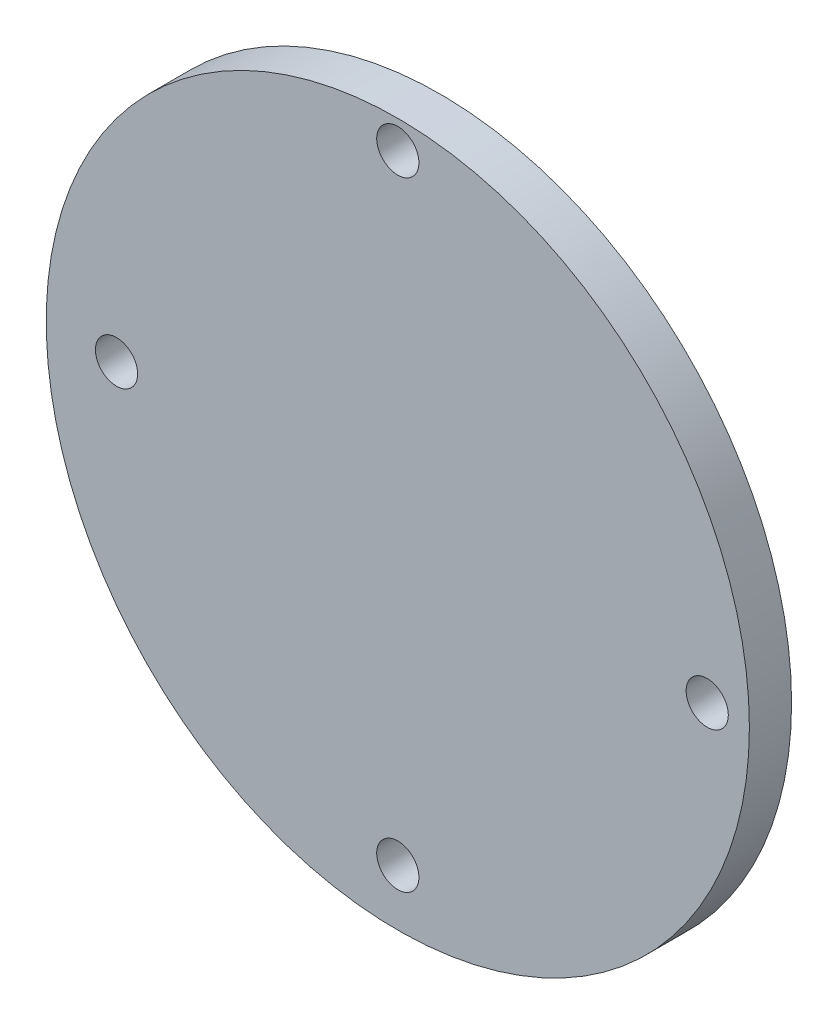
ISO-10303-21;
HEADER;
FILE_DESCRIPTION(('STEP AP214'),'2;1');
FILE_NAME('part.step','',(''),(''),'','','');
FILE_SCHEMA(('AUTOMOTIVE_DESIGN { 1 0 10303 214 1 1 1 1 }'));
ENDSEC;
DATA;
#1=APPLICATION_CONTEXT('core data for automotive mechanical design processes');
#2=APPLICATION_PROTOCOL_DEFINITION('international standard','automotive_design',2000,#1);
#3=PRODUCT_CONTEXT('',#1,'mechanical');
#4=PRODUCT('Part','Part','',(#3));
#5=PRODUCT_RELATED_PRODUCT_CATEGORY('part','',(#4));
#6=PRODUCT_DEFINITION_FORMATION('','',#4);
#7=PRODUCT_DEFINITION_CONTEXT('part definition',#1,'design');
#8=PRODUCT_DEFINITION('design','',#6,#7);
#9=PRODUCT_DEFINITION_SHAPE('','',#8);
#10=(LENGTH_UNIT() NAMED_UNIT(*) SI_UNIT(.MILLI.,.METRE.));
#11=(NAMED_UNIT(*) PLANE_ANGLE_UNIT() SI_UNIT($,.RADIAN.));
#12=(NAMED_UNIT(*) SI_UNIT($,.STERADIAN.) SOLID_ANGLE_UNIT());
#13=UNCERTAINTY_MEASURE_WITH_UNIT(LENGTH_MEASURE(1.E-05),#10,'distance_accuracy_value','');
#14=(GEOMETRIC_REPRESENTATION_CONTEXT(3) GLOBAL_UNCERTAINTY_ASSIGNED_CONTEXT((#13)) GLOBAL_UNIT_ASSIGNED_CONTEXT((#10,
#11,#12)) REPRESENTATION_CONTEXT('',''));
#15=CARTESIAN_POINT('',(0.,0.,0.));
#16=DIRECTION('',(0.,0.,1.));
#17=DIRECTION('',(1.,0.,0.));
#18=AXIS2_PLACEMENT_3D('',#15,#16,#17);
#19=CARTESIAN_POINT('',(0.,0.,-12.));
#20=DIRECTION('',(0.,0.,1.));
#21=DIRECTION('',(1.,0.,0.));
#22=AXIS2_PLACEMENT_3D('',#19,#20,#21);
#23=CYLINDRICAL_SURFACE('',#22,5.);
#24=CARTESIAN_POINT('',(0.,0.,-12.));
#25=DIRECTION('',(0.,0.,-1.));
#26=DIRECTION('',(-1.,0.,0.));
#27=AXIS2_PLACEMENT_3D('',#24,#25,#26);
#28=CIRCLE('',#27,5.);
#29=CARTESIAN_POINT('',(-5.,0.,-12.));
#30=VERTEX_POINT('',#29);
#31=EDGE_CURVE('E53',#30,#30,#28,.T.);
#32=ORIENTED_EDGE('',*,*,#31,.F.);
#33=EDGE_LOOP('',(#32));
#34=FACE_BOUND('',#33,.T.);
#35=CARTESIAN_POINT('',(0.,0.,0.));
#36=DIRECTION('',(0.,0.,-1.));
#37=DIRECTION('',(-1.,0.,0.));
#38=AXIS2_PLACEMENT_3D('',#35,#36,#37);
#39=CIRCLE('',#38,5.);
#40=CARTESIAN_POINT('',(-5.,0.,0.));
#41=VERTEX_POINT('',#40);
#42=EDGE_CURVE('E10',#41,#41,#39,.T.);
#43=ORIENTED_EDGE('',*,*,#42,.T.);
#44=EDGE_LOOP('',(#43));
#45=FACE_BOUND('',#44,.T.);
#46=CARTESIAN_POINT('',(0.,5.,-7.25));
#47=CARTESIAN_POINT('',(0.0690634072247759,4.99999883223344,-7.24999806188487));
#48=CARTESIAN_POINT('',(0.138148464858969,4.99855481776523,-7.24425704102184));
#49=CARTESIAN_POINT('',(0.27433860314211,4.99293428191577,-7.2214790405775));
#50=CARTESIAN_POINT('',(0.341442539058949,4.98875621183307,-7.20443565871846));
#51=CARTESIAN_POINT('',(0.471684060152148,4.97813021943366,-7.15963395544826));
#52=CARTESIAN_POINT('',(0.534826302858336,4.97168502368406,-7.1318885010706));
#53=CARTESIAN_POINT('',(0.655560109920356,4.95721119839661,-7.06651550829597));
#54=CARTESIAN_POINT('',(0.7131514869573,4.94918251545042,-7.02888763656755));
#55=CARTESIAN_POINT('',(0.822334939417433,4.93222844659834,-6.94399934195482));
#56=CARTESIAN_POINT('',(0.873796408384227,4.92328922623777,-6.89657368753402));
#57=CARTESIAN_POINT('',(0.968124106002754,4.90561350097941,-6.79378982924257));
#58=CARTESIAN_POINT('',(1.01098936412428,4.89687701906957,-6.73843073087792));
#59=CARTESIAN_POINT('',(1.08752211899919,4.88045646416425,-6.62033731105214));
#60=CARTESIAN_POINT('',(1.12104351327113,4.87278995392171,-6.55750564099133));
#61=CARTESIAN_POINT('',(1.17699742379211,4.85957912343519,-6.42687632361803));
#62=CARTESIAN_POINT('',(1.19943171286611,4.85403446393991,-6.35907947222853));
#63=CARTESIAN_POINT('',(1.23212903067024,4.84583730597959,-6.2218804181646));
#64=CARTESIAN_POINT('',(1.24262689027778,4.84312909229522,-6.15253758662517));
#65=CARTESIAN_POINT('',(1.25188481255654,4.84074468781451,-6.01302619248835));
#66=CARTESIAN_POINT('',(1.25064678484831,4.8410680037387,-5.94285776608449));
#67=CARTESIAN_POINT('',(1.2366554371994,4.84466004580515,-5.8054868268796));
#68=CARTESIAN_POINT('',(1.22418195015877,4.84785719168233,-5.73825364877909));
#69=CARTESIAN_POINT('',(1.18852015575259,4.85672258063736,-5.60686579090726));
#70=CARTESIAN_POINT('',(1.16533108505785,4.8623909997558,-5.54271133080918));
#71=CARTESIAN_POINT('',(1.10865789828096,4.87562594920155,-5.41855165312328));
#72=CARTESIAN_POINT('',(1.07507222269409,4.88321106224518,-5.35859485684204));
#73=CARTESIAN_POINT('',(0.998630230012462,4.89941425705322,-5.2450677418693));
#74=CARTESIAN_POINT('',(0.955772290674032,4.90803251945613,-5.19149854327729));
#75=CARTESIAN_POINT('',(0.860552853901015,4.92563233783151,-5.090663653588));
#76=CARTESIAN_POINT('',(0.807955215138216,4.93461724564976,-5.04362125828221));
#77=CARTESIAN_POINT('',(0.695509931253083,4.95171637982321,-4.95898229794675));
#78=CARTESIAN_POINT('',(0.63566206475662,4.95983057957846,-4.92138602144703));
#79=CARTESIAN_POINT('',(0.51009657390116,4.97431443411819,-4.85662451147968));
#80=CARTESIAN_POINT('',(0.44435949434052,4.98067800106438,-4.82949554978798));
#81=CARTESIAN_POINT('',(0.309063340119069,4.99089930826182,-4.78673557857536));
#82=CARTESIAN_POINT('',(0.23950499929207,4.99475752782734,-4.77110236965155));
#83=CARTESIAN_POINT('',(0.100449975325022,4.99946249392812,-4.75211869536763));
#84=CARTESIAN_POINT('',(0.0309972666568411,5.00038377923565,-4.74846414493725));
#85=CARTESIAN_POINT('',(-0.107527395667924,4.99932337345376,-4.75270750171291));
#86=CARTESIAN_POINT('',(-0.176599383037163,4.99734194368205,-4.76060436899928));
#87=CARTESIAN_POINT('',(-0.31134522398041,4.99074650939464,-4.78747575699282));
#88=CARTESIAN_POINT('',(-0.377054265807295,4.98617195154843,-4.80628438623082));
#89=CARTESIAN_POINT('',(-0.504381077043759,4.97490588861778,-4.85425590335704));
#90=CARTESIAN_POINT('',(-0.565998432527196,4.9682141697491,-4.88341983692764));
#91=CARTESIAN_POINT('',(-0.684602612024873,4.95327756605259,-4.95186344072894));
#92=CARTESIAN_POINT('',(-0.741487868196526,4.94500722805777,-4.9913134269973));
#93=CARTESIAN_POINT('',(-0.847938844702705,4.92787090989516,-5.07899159066414));
#94=CARTESIAN_POINT('',(-0.897503299144173,4.91900482709754,-5.12722128301409));
#95=CARTESIAN_POINT('',(-0.989158806727275,4.90140797467309,-5.23250163403705));
#96=CARTESIAN_POINT('',(-1.03103655635169,4.89268586822734,-5.28973975250202));
#97=CARTESIAN_POINT('',(-1.10459229917725,4.87660731981032,-5.41061052872143));
#98=CARTESIAN_POINT('',(-1.13627074513161,4.86925081722522,-5.47424290246646));
#99=CARTESIAN_POINT('',(-1.18829285050774,4.85681745612221,-5.60575476867757));
#100=CARTESIAN_POINT('',(-1.20870366387839,4.85172712743255,-5.67360635695334));
#101=CARTESIAN_POINT('',(-1.23778804996148,4.84438953408486,-5.81192469824092));
#102=CARTESIAN_POINT('',(-1.24646418956555,4.84214164766613,-5.88239087586041));
#103=CARTESIAN_POINT('',(-1.25169882527833,4.84079084336631,-6.02176751987934));
#104=CARTESIAN_POINT('',(-1.2485982481501,4.8415994394022,-6.09066452927061));
#105=CARTESIAN_POINT('',(-1.23114773192739,4.84606590839869,-6.22691990722332));
#106=CARTESIAN_POINT('',(-1.21679801890564,4.84972372409881,-6.29427830667804));
#107=CARTESIAN_POINT('',(-1.17744276620233,4.85942717235602,-6.42517371588784));
#108=CARTESIAN_POINT('',(-1.15250117056698,4.86545846030258,-6.48873108770017));
#109=CARTESIAN_POINT('',(-1.09272076133756,4.8792312977069,-6.61080448559474));
#110=CARTESIAN_POINT('',(-1.05788057502849,4.88697308433977,-6.6693198109891));
#111=CARTESIAN_POINT('',(-0.97822312386428,4.90354695219593,-6.78129552416835));
#112=CARTESIAN_POINT('',(-0.933169302426878,4.91240220693131,-6.8345842278533));
#113=CARTESIAN_POINT('',(-0.834824475991445,4.93006689371905,-6.93295587066284));
#114=CARTESIAN_POINT('',(-0.78153151771762,4.93887631439216,-6.97803685842748));
#115=CARTESIAN_POINT('',(-0.667056322252157,4.95564713039719,-7.05950942380384));
#116=CARTESIAN_POINT('',(-0.605748685263654,4.9635902780489,-7.09572884472632));
#117=CARTESIAN_POINT('',(-0.477721716258729,4.97754104145932,-7.15728955245044));
#118=CARTESIAN_POINT('',(-0.411006302863949,4.98355004333151,-7.18263863387378));
#119=CARTESIAN_POINT('',(-0.28700854436956,4.99206716304618,-7.21797652527471));
#120=CARTESIAN_POINT('',(-0.230316809090057,4.99502154210576,-7.22995936921119));
#121=CARTESIAN_POINT('',(-0.11575505961357,4.9989883769329,-7.24597161968495));
#122=CARTESIAN_POINT('',(-0.057885134368847,5.00000097875745,-7.25000162442108));
#123=CARTESIAN_POINT('',(0.,5.,-7.25));
#124=B_SPLINE_CURVE_WITH_KNOTS('',3,(#46,#47,#48,#49,#50,#51,#52,#53,#54,#55,#56,#57,#58,#59,
#60,#61,#62,#63,#64,#65,#66,#67,#68,#69,#70,#71,#72,#73,#74,#75,#76,#77,#78,#79,#80,#81,#82,#83,
#84,#85,#86,#87,#88,#89,#90,#91,#92,#93,#94,#95,#96,#97,#98,#99,#100,#101,#102,#103,#104,#105,
#106,#107,#108,#109,#110,#111,#112,#113,#114,#115,#116,#117,#118,#119,#120,#121,#122,#123),
.UNSPECIFIED.,.T.,.F.,(4,2,2,2,2,2,2,2,2,2,2,2,2,2,2,2,2,2,2,2,2,2,2,2,2,2,2,2,2,2,2,2,2,2,2,2,
2,2,4),(0.,0.206978093726575,0.414073531469916,0.620920751905089,0.827774950141107,
1.03845362864283,1.24915607983385,1.46298872954839,1.6767871764114,1.88630245916192,
2.09578365093914,2.30018747505848,2.50460586221699,2.71108773228233,2.91760575696802,
3.13001250807516,3.34242574631873,3.55556857507595,3.76867061407202,3.97631924124397,
4.18394917593952,4.38850228761698,4.59307606101909,4.80127989637793,5.00951969173349,
5.2228709100373,5.4362126562459,5.6482687884503,5.8602785271034,6.06619816998844,
6.27211367463362,6.4768033379954,6.68152140114085,6.89157980341592,7.10168808142015,
7.3156015458299,7.52936136517792,7.70285202451791,7.876329633692),.UNSPECIFIED.);
#125=CARTESIAN_POINT('',(0.,5.,-7.25));
#126=VERTEX_POINT('',#125);
#127=EDGE_CURVE('E66',#126,#126,#124,.T.);
#128=ORIENTED_EDGE('',*,*,#127,.T.);
#129=EDGE_LOOP('',(#128));
#130=FACE_BOUND('',#129,.T.);
#131=ADVANCED_FACE('F37',(#34,#45,#130),#23,.T.);
#132=CARTESIAN_POINT('',(0.,0.,-12.));
#133=DIRECTION('',(0.,0.,1.));
#134=DIRECTION('',(1.,0.,0.));
#135=AXIS2_PLACEMENT_3D('',#132,#133,#134);
#136=CYLINDRICAL_SURFACE('',#135,2.5);
#137=CARTESIAN_POINT('',(0.,0.,0.));
#138=DIRECTION('',(0.,0.,-1.));
#139=DIRECTION('',(-1.,0.,0.));
#140=AXIS2_PLACEMENT_3D('',#137,#138,#139);
#141=CIRCLE('',#140,2.5);
#142=CARTESIAN_POINT('',(-2.5,0.,0.));
#143=VERTEX_POINT('',#142);
#144=EDGE_CURVE('E58',#143,#143,#141,.T.);
#145=ORIENTED_EDGE('',*,*,#144,.F.);
#146=EDGE_LOOP('',(#145));
#147=FACE_BOUND('',#146,.T.);
#148=CARTESIAN_POINT('',(0.,0.,-12.));
#149=DIRECTION('',(0.,0.,-1.));
#150=DIRECTION('',(-1.,0.,0.));
#151=AXIS2_PLACEMENT_3D('',#148,#149,#150);
#152=CIRCLE('',#151,2.5);
#153=CARTESIAN_POINT('',(-2.5,0.,-12.));
#154=VERTEX_POINT('',#153);
#155=EDGE_CURVE('E57',#154,#154,#152,.T.);
#156=ORIENTED_EDGE('',*,*,#155,.T.);
#157=EDGE_LOOP('',(#156));
#158=FACE_BOUND('',#157,.T.);
#159=CARTESIAN_POINT('',(0.,2.5,-7.25));
#160=CARTESIAN_POINT('',(0.0657149536912331,2.49999641755189,-7.24999587210062));
#161=CARTESIAN_POINT('',(0.131508249622541,2.49738113774397,-7.24478740859791));
#162=CARTESIAN_POINT('',(0.261150294085531,2.48717695046745,-7.22418389957385));
#163=CARTESIAN_POINT('',(0.32499510839188,2.47957859786229,-7.20876950875294));
#164=CARTESIAN_POINT('',(0.448666931100718,2.46020349254139,-7.16850773922901));
#165=CARTESIAN_POINT('',(0.508508503673975,2.448442989719,-7.14369701968999));
#166=CARTESIAN_POINT('',(0.623090771008206,2.42182220644723,-7.08553672329382));
#167=CARTESIAN_POINT('',(0.677831867487562,2.40696217041913,-7.05218781968893));
#168=CARTESIAN_POINT('',(0.784384772202399,2.37445322822571,-6.97560343814338));
#169=CARTESIAN_POINT('',(0.83581901390264,2.3566899890942,-6.93189190095045));
#170=CARTESIAN_POINT('',(0.930974306083722,2.3207496280843,-6.83684815094121));
#171=CARTESIAN_POINT('',(0.974689478883458,2.30257220261294,-6.78551018528445));
#172=CARTESIAN_POINT('',(1.05656500056285,2.26623688996684,-6.67189581309577));
#173=CARTESIAN_POINT('',(1.09403166943955,2.24818983712665,-6.60907987706761));
#174=CARTESIAN_POINT('',(1.15771028361337,2.21607473465401,-6.47704083001723));
#175=CARTESIAN_POINT('',(1.18393026870792,2.20200384508737,-6.40782233909656));
#176=CARTESIAN_POINT('',(1.22266555273574,2.18072333797261,-6.2691686182226));
#177=CARTESIAN_POINT('',(1.23590732135055,2.17315339479642,-6.19999443491576));
#178=CARTESIAN_POINT('',(1.25053374163606,2.1647736243566,-6.06002645277565));
#179=CARTESIAN_POINT('',(1.25193011046634,2.1639571167911,-5.98923432391106));
#180=CARTESIAN_POINT('',(1.24335910896537,2.1688866282156,-5.85714246960579));
#181=CARTESIAN_POINT('',(1.23473069942103,2.17385954577517,-5.79571996097119));
#182=CARTESIAN_POINT('',(1.20867481132117,2.18845285917313,-5.6753476132837));
#183=CARTESIAN_POINT('',(1.19124452987207,2.1980747353972,-5.61639856836836));
#184=CARTESIAN_POINT('',(1.14776222548251,2.22109345515926,-5.50096358429293));
#185=CARTESIAN_POINT('',(1.12151883389499,2.23457300829998,-5.44456700151776));
#186=CARTESIAN_POINT('',(1.061302109585,2.26379255351755,-5.33670713426249));
#187=CARTESIAN_POINT('',(1.02732530476558,2.27953355975238,-5.28524608049989));
#188=CARTESIAN_POINT('',(0.947582568640986,2.31391447379107,-5.18184843407097));
#189=CARTESIAN_POINT('',(0.900868072961602,2.33266887795933,-5.1306789080298));
#190=CARTESIAN_POINT('',(0.799444473426717,2.36934529125509,-5.03658072676137));
#191=CARTESIAN_POINT('',(0.744731570717857,2.38726689948501,-4.99365600995765));
#192=CARTESIAN_POINT('',(0.625645632289811,2.42127484103705,-4.91539292371284));
#193=CARTESIAN_POINT('',(0.560941989499262,2.43723730202509,-4.88049940944282));
#194=CARTESIAN_POINT('',(0.425582769360997,2.46447351401553,-4.82237871369624));
#195=CARTESIAN_POINT('',(0.354931970331596,2.47575098679441,-4.79914226873104));
#196=CARTESIAN_POINT('',(0.215958114575877,2.49155417176795,-4.76690574535415));
#197=CARTESIAN_POINT('',(0.147926913185406,2.4965617287664,-4.75688595531653));
#198=CARTESIAN_POINT('',(0.0109744999366923,2.50091266823877,-4.74816908608189));
#199=CARTESIAN_POINT('',(-0.0579462748373765,2.5002587340164,-4.74946664295065));
#200=CARTESIAN_POINT('',(-0.189041214982492,2.49363990316801,-4.76275836052344));
#201=CARTESIAN_POINT('',(-0.251324260062442,2.48809057110237,-4.77391566591254));
#202=CARTESIAN_POINT('',(-0.373008615377395,2.47277714143524,-4.80529758986886));
#203=CARTESIAN_POINT('',(-0.432409607113746,2.46301257917916,-4.8255232080667));
#204=CARTESIAN_POINT('',(-0.548610760562082,2.43980314267087,-4.87499808304146));
#205=CARTESIAN_POINT('',(-0.605287996257692,2.42626102212424,-4.90448881264602));
#206=CARTESIAN_POINT('',(-0.713076702123651,2.39679967896386,-4.97138441955755));
#207=CARTESIAN_POINT('',(-0.764185787219103,2.38087944457231,-5.00879266824179));
#208=CARTESIAN_POINT('',(-0.864709611613316,2.3463527667183,-5.09470053166609));
#209=CARTESIAN_POINT('',(-0.913465097280799,2.32763606060552,-5.14392858556696));
#210=CARTESIAN_POINT('',(-1.00232040139155,2.29077989504843,-5.24990643908663));
#211=CARTESIAN_POINT('',(-1.04241423211355,2.27264084226908,-5.30666139852047));
#212=CARTESIAN_POINT('',(-1.11463489312212,2.23813990282585,-5.42955456775039));
#213=CARTESIAN_POINT('',(-1.1462818698483,2.2219066207934,-5.49601408276074));
#214=CARTESIAN_POINT('',(-1.19760353251725,2.19467590460158,-5.63438758461565));
#215=CARTESIAN_POINT('',(-1.21729364485946,2.18367172800773,-5.70629440812648));
#216=CARTESIAN_POINT('',(-1.2423271093121,2.16951876260833,-5.84613777857681));
#217=CARTESIAN_POINT('',(-1.24886624550108,2.16571729325614,-5.91379281678629));
#218=CARTESIAN_POINT('',(-1.25086144297598,2.16456693307719,-6.04930883396341));
#219=CARTESIAN_POINT('',(-1.2463223082805,2.16721524534441,-6.11716971092429));
#220=CARTESIAN_POINT('',(-1.22740765699033,2.17797327562531,-6.24435437691502));
#221=CARTESIAN_POINT('',(-1.2140103929285,2.18553868102992,-6.3038755876805));
#222=CARTESIAN_POINT('',(-1.17896919778081,2.20463770234897,-6.41976014928088));
#223=CARTESIAN_POINT('',(-1.15732261394976,2.21617259462095,-6.47612247761496));
#224=CARTESIAN_POINT('',(-1.10476968162585,2.2428566295566,-6.58828106373326));
#225=CARTESIAN_POINT('',(-1.07333892227057,2.25819652995238,-6.64378487728713));
#226=CARTESIAN_POINT('',(-1.00268871454579,2.29044164543238,-6.74909317022573));
#227=CARTESIAN_POINT('',(-0.963465214048311,2.30734767243153,-6.79889466314811));
#228=CARTESIAN_POINT('',(-0.872754158330802,2.34327903949141,-6.89767747794702));
#229=CARTESIAN_POINT('',(-0.820355528762715,2.36231229139336,-6.9458238779524));
#230=CARTESIAN_POINT('',(-0.70769350777535,2.3984719031886,-7.03282872927954));
#231=CARTESIAN_POINT('',(-0.647425904070982,2.4155972326005,-7.07168217428286));
#232=CARTESIAN_POINT('',(-0.519914496024934,2.44622511981379,-7.13904545345276));
#233=CARTESIAN_POINT('',(-0.452624379918268,2.45970120703636,-7.16748021176429));
#234=CARTESIAN_POINT('',(-0.313427626617739,2.48126676704332,-7.21226020989869));
#235=CARTESIAN_POINT('',(-0.241534749528958,2.48937154216165,-7.22863980853697));
#236=CARTESIAN_POINT('',(-0.14075243310423,2.49619327387079,-7.24237176384481));
#237=CARTESIAN_POINT('',(-0.112702349299373,2.49761706674002,-7.24522830107952));
#238=CARTESIAN_POINT('',(-0.0564396647589468,2.49952121222331,-7.24904333189601));
#239=CARTESIAN_POINT('',(-0.0282270595592266,2.50000153879704,-7.250001773089));
#240=CARTESIAN_POINT('',(0.,2.5,-7.25));
#241=B_SPLINE_CURVE_WITH_KNOTS('',3,(#159,#160,#161,#162,#163,#164,#165,#166,#167,#168,#169,
#170,#171,#172,#173,#174,#175,#176,#177,#178,#179,#180,#181,#182,#183,#184,#185,#186,#187,#188,
#189,#190,#191,#192,#193,#194,#195,#196,#197,#198,#199,#200,#201,#202,#203,#204,#205,#206,#207,
#208,#209,#210,#211,#212,#213,#214,#215,#216,#217,#218,#219,#220,#221,#222,#223,#224,#225,#226,
#227,#228,#229,#230,#231,#232,#233,#234,#235,#236,#237,#238,#239,#240),.UNSPECIFIED.,.T.,.F.,(4,
2,2,2,2,2,2,2,2,2,2,2,2,2,2,2,2,2,2,2,2,2,2,2,2,2,2,2,2,2,2,2,2,2,2,2,2,2,2,2,4),(0.,
0.197030321775366,0.394435187136497,0.591077694365373,0.78770470072696,0.996227198397611,
1.20490779706754,1.42977158038441,1.65447434872851,1.86572515175287,2.07676696661275,
2.26257140511651,2.44843504907098,2.63862800210609,2.82890651575277,3.04331176667348,
3.25781918248358,3.48228777768051,3.70657771140349,3.91229113089182,4.11790705639345,
4.30758633132652,4.49728652038664,4.69241070034873,4.88761813435424,5.10199513305524,
5.3165198576929,5.54143352699592,5.76605639925972,5.96911634372967,6.17208824825007,
6.35572412805228,6.53941910979598,6.73545570969518,6.93159451423697,7.15156553440623,
7.37165479220716,7.59330017078656,7.81431135781163,7.89894100172122,7.98357298143559),.UNSPECIFIED.);
#242=CARTESIAN_POINT('',(0.,2.5,-7.25));
#243=VERTEX_POINT('',#242);
#244=EDGE_CURVE('E62',#243,#243,#241,.T.);
#245=ORIENTED_EDGE('',*,*,#244,.F.);
#246=EDGE_LOOP('',(#245));
#247=FACE_BOUND('',#246,.T.);
#248=ADVANCED_FACE('F107',(#147,#158,#247),#136,.F.);
#249=CARTESIAN_POINT('',(0.,0.,3.));
#250=DIRECTION('',(0.,0.,-1.));
#251=DIRECTION('',(-1.,0.,0.));
#252=AXIS2_PLACEMENT_3D('',#249,#250,#251);
#253=CYLINDRICAL_SURFACE('',#252,25.);
#254=CARTESIAN_POINT('',(0.,0.,3.));
#255=DIRECTION('',(0.,0.,1.));
#256=DIRECTION('',(1.,0.,0.));
#257=AXIS2_PLACEMENT_3D('',#254,#255,#256);
#258=CIRCLE('',#257,25.);
#259=CARTESIAN_POINT('',(25.,0.,3.));
#260=VERTEX_POINT('',#259);
#261=EDGE_CURVE('E46',#260,#260,#258,.T.);
#262=ORIENTED_EDGE('',*,*,#261,.F.);
#263=EDGE_LOOP('',(#262));
#264=FACE_BOUND('',#263,.T.);
#265=CARTESIAN_POINT('',(0.,0.,0.));
#266=DIRECTION('',(0.,0.,1.));
#267=DIRECTION('',(1.,0.,0.));
#268=AXIS2_PLACEMENT_3D('',#265,#266,#267);
#269=CIRCLE('',#268,25.);
#270=CARTESIAN_POINT('',(25.,0.,0.));
#271=VERTEX_POINT('',#270);
#272=EDGE_CURVE('E41',#271,#271,#269,.T.);
#273=ORIENTED_EDGE('',*,*,#272,.T.);
#274=EDGE_LOOP('',(#273));
#275=FACE_BOUND('',#274,.T.);
#276=ADVANCED_FACE('F39',(#264,#275),#253,.T.);
#277=CARTESIAN_POINT('',(0.,0.,3.));
#278=DIRECTION('',(0.,0.,1.));
#279=DIRECTION('',(1.,0.,0.));
#280=AXIS2_PLACEMENT_3D('',#277,#278,#279);
#281=PLANE('',#280);
#282=CARTESIAN_POINT('',(22.,0.,3.));
#283=DIRECTION('',(0.,0.,1.));
#284=DIRECTION('',(1.,0.,0.));
#285=AXIS2_PLACEMENT_3D('',#282,#283,#284);
#286=CIRCLE('',#285,1.5);
#287=CARTESIAN_POINT('',(23.5,0.,3.));
#288=VERTEX_POINT('',#287);
#289=EDGE_CURVE('E147',#288,#288,#286,.T.);
#290=ORIENTED_EDGE('',*,*,#289,.F.);
#291=EDGE_LOOP('',(#290));
#292=FACE_BOUND('',#291,.T.);
#293=CARTESIAN_POINT('',(-20.,0.,3.));
#294=DIRECTION('',(0.,0.,1.));
#295=DIRECTION('',(1.,0.,0.));
#296=AXIS2_PLACEMENT_3D('',#293,#294,#295);
#297=CIRCLE('',#296,1.5);
#298=CARTESIAN_POINT('',(-18.5,0.,3.));
#299=VERTEX_POINT('',#298);
#300=EDGE_CURVE('E154',#299,#299,#297,.T.);
#301=ORIENTED_EDGE('',*,*,#300,.F.);
#302=EDGE_LOOP('',(#301));
#303=FACE_BOUND('',#302,.T.);
#304=CARTESIAN_POINT('',(0.,-21.,3.));
#305=DIRECTION('',(0.,0.,1.));
#306=DIRECTION('',(1.,0.,0.));
#307=AXIS2_PLACEMENT_3D('',#304,#305,#306);
#308=CIRCLE('',#307,1.5);
#309=CARTESIAN_POINT('',(1.5,-21.,3.));
#310=VERTEX_POINT('',#309);
#311=EDGE_CURVE('E162',#310,#310,#308,.T.);
#312=ORIENTED_EDGE('',*,*,#311,.F.);
#313=EDGE_LOOP('',(#312));
#314=FACE_BOUND('',#313,.T.);
#315=CARTESIAN_POINT('',(0.,23.,3.));
#316=DIRECTION('',(0.,0.,1.));
#317=DIRECTION('',(1.,0.,0.));
#318=AXIS2_PLACEMENT_3D('',#315,#316,#317);
#319=CIRCLE('',#318,1.5);
#320=CARTESIAN_POINT('',(1.5,23.,3.));
#321=VERTEX_POINT('',#320);
#322=EDGE_CURVE('E170',#321,#321,#319,.T.);
#323=ORIENTED_EDGE('',*,*,#322,.F.);
#324=EDGE_LOOP('',(#323));
#325=FACE_BOUND('',#324,.T.);
#326=ORIENTED_EDGE('',*,*,#261,.T.);
#327=EDGE_LOOP('',(#326));
#328=FACE_BOUND('',#327,.T.);
#329=ADVANCED_FACE('F118',(#292,#303,#314,#325,#328),#281,.T.);
#330=CARTESIAN_POINT('',(0.,0.,0.));
#331=DIRECTION('',(0.,0.,1.));
#332=DIRECTION('',(1.,0.,0.));
#333=AXIS2_PLACEMENT_3D('',#330,#331,#332);
#334=PLANE('',#333);
#335=CARTESIAN_POINT('',(22.,0.,0.));
#336=DIRECTION('',(0.,0.,1.));
#337=DIRECTION('',(1.,0.,0.));
#338=AXIS2_PLACEMENT_3D('',#335,#336,#337);
#339=CIRCLE('',#338,1.5);
#340=CARTESIAN_POINT('',(23.5,0.,0.));
#341=VERTEX_POINT('',#340);
#342=EDGE_CURVE('E75',#341,#341,#339,.F.);
#343=ORIENTED_EDGE('',*,*,#342,.F.);
#344=EDGE_LOOP('',(#343));
#345=FACE_BOUND('',#344,.T.);
#346=CARTESIAN_POINT('',(-20.,0.,0.));
#347=DIRECTION('',(0.,0.,1.));
#348=DIRECTION('',(1.,0.,0.));
#349=AXIS2_PLACEMENT_3D('',#346,#347,#348);
#350=CIRCLE('',#349,1.5);
#351=CARTESIAN_POINT('',(-18.5,0.,0.));
#352=VERTEX_POINT('',#351);
#353=EDGE_CURVE('E150',#352,#352,#350,.F.);
#354=ORIENTED_EDGE('',*,*,#353,.F.);
#355=EDGE_LOOP('',(#354));
#356=FACE_BOUND('',#355,.T.);
#357=CARTESIAN_POINT('',(0.,-21.,0.));
#358=DIRECTION('',(0.,0.,1.));
#359=DIRECTION('',(1.,0.,0.));
#360=AXIS2_PLACEMENT_3D('',#357,#358,#359);
#361=CIRCLE('',#360,1.5);
#362=CARTESIAN_POINT('',(1.5,-21.,0.));
#363=VERTEX_POINT('',#362);
#364=EDGE_CURVE('E158',#363,#363,#361,.F.);
#365=ORIENTED_EDGE('',*,*,#364,.F.);
#366=EDGE_LOOP('',(#365));
#367=FACE_BOUND('',#366,.T.);
#368=CARTESIAN_POINT('',(0.,23.,0.));
#369=DIRECTION('',(0.,0.,1.));
#370=DIRECTION('',(1.,0.,0.));
#371=AXIS2_PLACEMENT_3D('',#368,#369,#370);
#372=CIRCLE('',#371,1.5);
#373=CARTESIAN_POINT('',(1.5,23.,0.));
#374=VERTEX_POINT('',#373);
#375=EDGE_CURVE('E166',#374,#374,#372,.F.);
#376=ORIENTED_EDGE('',*,*,#375,.F.);
#377=EDGE_LOOP('',(#376));
#378=FACE_BOUND('',#377,.T.);
#379=ORIENTED_EDGE('',*,*,#42,.F.);
#380=EDGE_LOOP('',(#379));
#381=FACE_BOUND('',#380,.T.);
#382=ORIENTED_EDGE('',*,*,#272,.F.);
#383=EDGE_LOOP('',(#382));
#384=FACE_BOUND('',#383,.T.);
#385=ADVANCED_FACE('F120',(#345,#356,#367,#378,#381,#384),#334,.F.);
#386=CARTESIAN_POINT('',(0.,0.,-12.));
#387=DIRECTION('',(0.,0.,-1.));
#388=DIRECTION('',(-1.,0.,0.));
#389=AXIS2_PLACEMENT_3D('',#386,#387,#388);
#390=PLANE('',#389);
#391=ORIENTED_EDGE('',*,*,#31,.T.);
#392=EDGE_LOOP('',(#391));
#393=FACE_BOUND('',#392,.T.);
#394=ORIENTED_EDGE('',*,*,#155,.F.);
#395=EDGE_LOOP('',(#394));
#396=FACE_BOUND('',#395,.T.);
#397=ADVANCED_FACE('F117',(#393,#396),#390,.T.);
#398=ORIENTED_EDGE('',*,*,#144,.T.);
#399=EDGE_LOOP('',(#398));
#400=FACE_BOUND('',#399,.T.);
#401=ADVANCED_FACE('F124',(#400),#334,.F.);
#402=CARTESIAN_POINT('',(0.,25.001,-6.));
#403=DIRECTION('',(0.,-1.,0.));
#404=DIRECTION('',(0.,0.,-1.));
#405=AXIS2_PLACEMENT_3D('',#402,#403,#404);
#406=CYLINDRICAL_SURFACE('',#405,1.25);
#407=ORIENTED_EDGE('',*,*,#244,.T.);
#408=EDGE_LOOP('',(#407));
#409=FACE_BOUND('',#408,.T.);
#410=ORIENTED_EDGE('',*,*,#127,.F.);
#411=EDGE_LOOP('',(#410));
#412=FACE_BOUND('',#411,.T.);
#413=ADVANCED_FACE('F81',(#409,#412),#406,.F.);
#414=CARTESIAN_POINT('',(0.,23.,-12.001));
#415=DIRECTION('',(0.,0.,1.));
#416=DIRECTION('',(1.,0.,0.));
#417=AXIS2_PLACEMENT_3D('',#414,#415,#416);
#418=CYLINDRICAL_SURFACE('',#417,1.5);
#419=ORIENTED_EDGE('',*,*,#322,.T.);
#420=EDGE_LOOP('',(#419));
#421=FACE_BOUND('',#420,.T.);
#422=ORIENTED_EDGE('',*,*,#375,.T.);
#423=EDGE_LOOP('',(#422));
#424=FACE_BOUND('',#423,.T.);
#425=ADVANCED_FACE('F87',(#421,#424),#418,.F.);
#426=CARTESIAN_POINT('',(0.,-21.,-12.001));
#427=DIRECTION('',(0.,0.,1.));
#428=DIRECTION('',(1.,0.,0.));
#429=AXIS2_PLACEMENT_3D('',#426,#427,#428);
#430=CYLINDRICAL_SURFACE('',#429,1.5);
#431=ORIENTED_EDGE('',*,*,#311,.T.);
#432=EDGE_LOOP('',(#431));
#433=FACE_BOUND('',#432,.T.);
#434=ORIENTED_EDGE('',*,*,#364,.T.);
#435=EDGE_LOOP('',(#434));
#436=FACE_BOUND('',#435,.T.);
#437=ADVANCED_FACE('F90',(#433,#436),#430,.F.);
#438=CARTESIAN_POINT('',(-20.,0.,-12.001));
#439=DIRECTION('',(0.,0.,1.));
#440=DIRECTION('',(1.,0.,0.));
#441=AXIS2_PLACEMENT_3D('',#438,#439,#440);
#442=CYLINDRICAL_SURFACE('',#441,1.5);
#443=ORIENTED_EDGE('',*,*,#300,.T.);
#444=EDGE_LOOP('',(#443));
#445=FACE_BOUND('',#444,.T.);
#446=ORIENTED_EDGE('',*,*,#353,.T.);
#447=EDGE_LOOP('',(#446));
#448=FACE_BOUND('',#447,.T.);
#449=ADVANCED_FACE('F94',(#445,#448),#442,.F.);
#450=CARTESIAN_POINT('',(22.,0.,-12.001));
#451=DIRECTION('',(0.,0.,1.));
#452=DIRECTION('',(1.,0.,0.));
#453=AXIS2_PLACEMENT_3D('',#450,#451,#452);
#454=CYLINDRICAL_SURFACE('',#453,1.5);
#455=ORIENTED_EDGE('',*,*,#289,.T.);
#456=EDGE_LOOP('',(#455));
#457=FACE_BOUND('',#456,.T.);
#458=ORIENTED_EDGE('',*,*,#342,.T.);
#459=EDGE_LOOP('',(#458));
#460=FACE_BOUND('',#459,.T.);
#461=ADVANCED_FACE('F98',(#457,#460),#454,.F.);
#462=CLOSED_SHELL('',(#131,#248,#276,#329,#385,#397,#401,#413,#425,#437,#449,#461));
#463=MANIFOLD_SOLID_BREP('B2',#462);
#464=ADVANCED_BREP_SHAPE_REPRESENTATION('',(#18,#463),#14);
#465=SHAPE_DEFINITION_REPRESENTATION(#9,#464);
ENDSEC;
END-ISO-10303-21;
